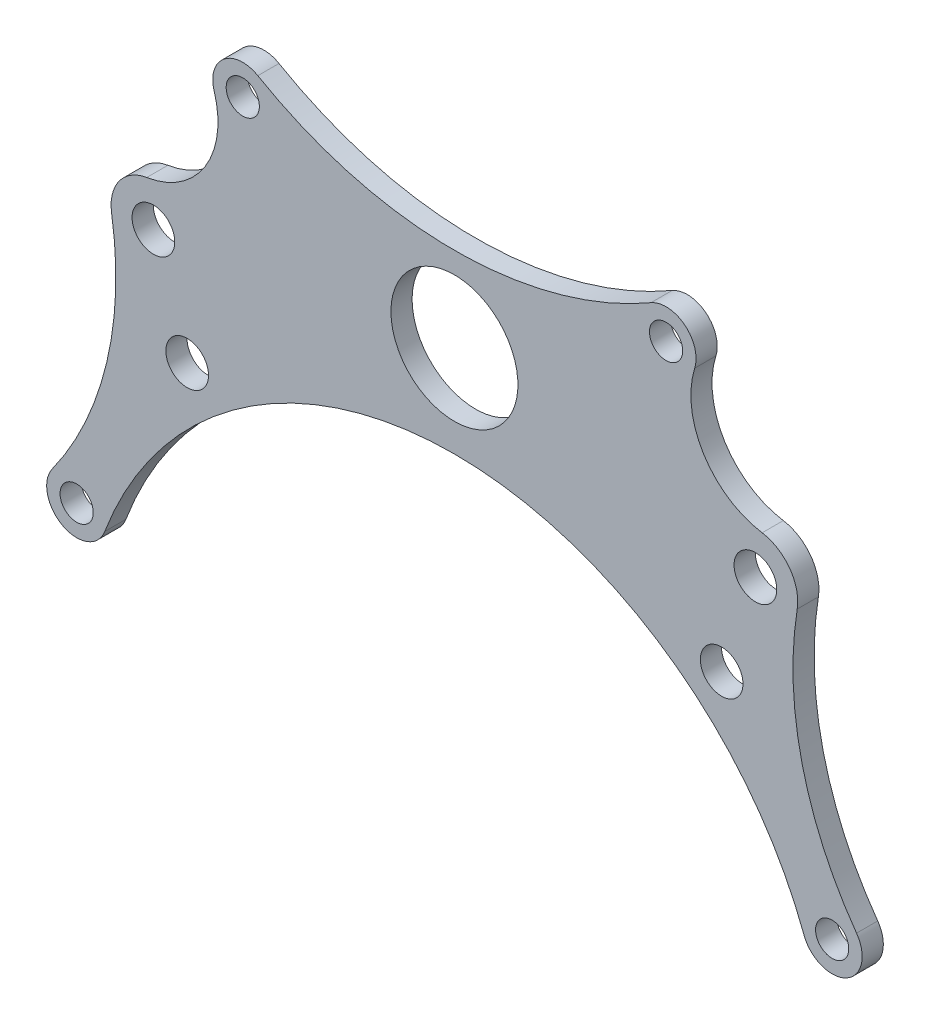
ISO-10303-21;
HEADER;
FILE_DESCRIPTION(('STEP AP214'),'2;1');
FILE_NAME('part.step','',(''),(''),'','','');
FILE_SCHEMA(('AUTOMOTIVE_DESIGN { 1 0 10303 214 1 1 1 1 }'));
ENDSEC;
DATA;
#1=APPLICATION_CONTEXT('core data for automotive mechanical design processes');
#2=APPLICATION_PROTOCOL_DEFINITION('international standard','automotive_design',2000,#1);
#3=PRODUCT_CONTEXT('',#1,'mechanical');
#4=PRODUCT('Part','Part','',(#3));
#5=PRODUCT_RELATED_PRODUCT_CATEGORY('part','',(#4));
#6=PRODUCT_DEFINITION_FORMATION('','',#4);
#7=PRODUCT_DEFINITION_CONTEXT('part definition',#1,'design');
#8=PRODUCT_DEFINITION('design','',#6,#7);
#9=PRODUCT_DEFINITION_SHAPE('','',#8);
#10=(LENGTH_UNIT() NAMED_UNIT(*) SI_UNIT(.MILLI.,.METRE.));
#11=(NAMED_UNIT(*) PLANE_ANGLE_UNIT() SI_UNIT($,.RADIAN.));
#12=(NAMED_UNIT(*) SI_UNIT($,.STERADIAN.) SOLID_ANGLE_UNIT());
#13=UNCERTAINTY_MEASURE_WITH_UNIT(LENGTH_MEASURE(1.E-05),#10,'distance_accuracy_value','');
#14=(GEOMETRIC_REPRESENTATION_CONTEXT(3) GLOBAL_UNCERTAINTY_ASSIGNED_CONTEXT((#13)) GLOBAL_UNIT_ASSIGNED_CONTEXT((#10,
#11,#12)) REPRESENTATION_CONTEXT('',''));
#15=CARTESIAN_POINT('',(0.,0.,0.));
#16=DIRECTION('',(0.,0.,1.));
#17=DIRECTION('',(1.,0.,0.));
#18=AXIS2_PLACEMENT_3D('',#15,#16,#17);
#19=CARTESIAN_POINT('',(0.,0.,-1.5875));
#20=DIRECTION('',(0.,0.,1.));
#21=DIRECTION('',(1.,0.,0.));
#22=AXIS2_PLACEMENT_3D('',#19,#20,#21);
#23=PLANE('',#22);
#24=CARTESIAN_POINT('',(56.664818962211,-48.4680925679622,-1.5875));
#25=DIRECTION('',(0.,0.,-1.));
#26=DIRECTION('',(-1.,0.,0.));
#27=AXIS2_PLACEMENT_3D('',#24,#25,#26);
#28=CIRCLE('',#27,2.48920000000113);
#29=CARTESIAN_POINT('',(54.1756189622098,-48.4680925679622,-1.5875));
#30=VERTEX_POINT('',#29);
#31=EDGE_CURVE('E206',#30,#30,#28,.F.);
#32=ORIENTED_EDGE('',*,*,#31,.T.);
#33=EDGE_LOOP('',(#32));
#34=FACE_BOUND('',#33,.T.);
#35=CARTESIAN_POINT('',(45.1516819359939,-7.18637727584978,-1.5875));
#36=DIRECTION('',(0.,0.,-1.));
#37=DIRECTION('',(-1.,0.,0.));
#38=AXIS2_PLACEMENT_3D('',#35,#36,#37);
#39=CIRCLE('',#38,3.2004);
#40=CARTESIAN_POINT('',(41.9512819359939,-7.18637727584978,-1.5875));
#41=VERTEX_POINT('',#40);
#42=EDGE_CURVE('E209',#41,#41,#39,.F.);
#43=ORIENTED_EDGE('',*,*,#42,.T.);
#44=EDGE_LOOP('',(#43));
#45=FACE_BOUND('',#44,.T.);
#46=CARTESIAN_POINT('',(31.7499999999987,16.7527845666329,-1.5875));
#47=DIRECTION('',(0.,0.,-1.));
#48=DIRECTION('',(-1.,0.,0.));
#49=AXIS2_PLACEMENT_3D('',#46,#47,#48);
#50=CIRCLE('',#49,2.48920000000112);
#51=CARTESIAN_POINT('',(29.2607999999976,16.7527845666329,-1.5875));
#52=VERTEX_POINT('',#51);
#53=EDGE_CURVE('E212',#52,#52,#50,.F.);
#54=ORIENTED_EDGE('',*,*,#53,.T.);
#55=EDGE_LOOP('',(#54));
#56=FACE_BOUND('',#55,.T.);
#57=CARTESIAN_POINT('',(-31.7499999999987,16.7527845666329,-1.5875));
#58=DIRECTION('',(0.,0.,-1.));
#59=DIRECTION('',(-1.,0.,0.));
#60=AXIS2_PLACEMENT_3D('',#57,#58,#59);
#61=CIRCLE('',#60,2.48919999999887);
#62=CARTESIAN_POINT('',(-34.2391999999976,16.7527845666329,-1.5875));
#63=VERTEX_POINT('',#62);
#64=EDGE_CURVE('E215',#63,#63,#61,.F.);
#65=ORIENTED_EDGE('',*,*,#64,.T.);
#66=EDGE_LOOP('',(#65));
#67=FACE_BOUND('',#66,.T.);
#68=CARTESIAN_POINT('',(-45.1516819359939,-7.18637727584978,-1.5875));
#69=DIRECTION('',(0.,0.,-1.));
#70=DIRECTION('',(-1.,0.,0.));
#71=AXIS2_PLACEMENT_3D('',#68,#69,#70);
#72=CIRCLE('',#71,3.2004);
#73=CARTESIAN_POINT('',(-48.3520819359939,-7.18637727584978,-1.5875));
#74=VERTEX_POINT('',#73);
#75=EDGE_CURVE('E218',#74,#74,#72,.F.);
#76=ORIENTED_EDGE('',*,*,#75,.T.);
#77=EDGE_LOOP('',(#76));
#78=FACE_BOUND('',#77,.T.);
#79=CARTESIAN_POINT('',(-56.664818962211,-48.4680925679622,-1.5875));
#80=DIRECTION('',(0.,0.,-1.));
#81=DIRECTION('',(-1.,0.,0.));
#82=AXIS2_PLACEMENT_3D('',#79,#80,#81);
#83=CIRCLE('',#82,2.48920000000113);
#84=CARTESIAN_POINT('',(-59.1540189622121,-48.4680925679622,-1.5875));
#85=VERTEX_POINT('',#84);
#86=EDGE_CURVE('E221',#85,#85,#83,.F.);
#87=ORIENTED_EDGE('',*,*,#86,.T.);
#88=EDGE_LOOP('',(#87));
#89=FACE_BOUND('',#88,.T.);
#90=CARTESIAN_POINT('',(-40.0870796431292,-21.9850959899069,-1.5875));
#91=DIRECTION('',(0.,0.,-1.));
#92=DIRECTION('',(-1.,0.,0.));
#93=AXIS2_PLACEMENT_3D('',#90,#91,#92);
#94=CIRCLE('',#93,3.2004);
#95=CARTESIAN_POINT('',(-43.2874796431292,-21.9850959899069,-1.5875));
#96=VERTEX_POINT('',#95);
#97=EDGE_CURVE('E224',#96,#96,#94,.F.);
#98=ORIENTED_EDGE('',*,*,#97,.T.);
#99=EDGE_LOOP('',(#98));
#100=FACE_BOUND('',#99,.T.);
#101=CARTESIAN_POINT('',(40.0870796431292,-21.9850959899069,-1.5875));
#102=DIRECTION('',(0.,0.,-1.));
#103=DIRECTION('',(-1.,0.,0.));
#104=AXIS2_PLACEMENT_3D('',#101,#102,#103);
#105=CIRCLE('',#104,3.2004);
#106=CARTESIAN_POINT('',(36.8866796431292,-21.9850959899069,-1.5875));
#107=VERTEX_POINT('',#106);
#108=EDGE_CURVE('E227',#107,#107,#105,.F.);
#109=ORIENTED_EDGE('',*,*,#108,.T.);
#110=EDGE_LOOP('',(#109));
#111=FACE_BOUND('',#110,.T.);
#112=CARTESIAN_POINT('',(0.,0.,-1.5875));
#113=DIRECTION('',(0.,0.,-1.));
#114=DIRECTION('',(-1.,0.,0.));
#115=AXIS2_PLACEMENT_3D('',#112,#113,#114);
#116=CIRCLE('',#115,9.525);
#117=CARTESIAN_POINT('',(-9.525,0.,-1.5875));
#118=VERTEX_POINT('',#117);
#119=EDGE_CURVE('E230',#118,#118,#116,.F.);
#120=ORIENTED_EDGE('',*,*,#119,.T.);
#121=EDGE_LOOP('',(#120));
#122=FACE_BOUND('',#121,.T.);
#123=CARTESIAN_POINT('',(-56.664818962211,-48.4680925679622,-1.5875));
#124=DIRECTION('',(0.,0.,-1.));
#125=DIRECTION('',(-1.,0.,0.));
#126=AXIS2_PLACEMENT_3D('',#123,#124,#125);
#127=CIRCLE('',#126,4.50000000000113);
#128=CARTESIAN_POINT('',(-60.3201025397103,-45.8434207850389,-1.5875));
#129=VERTEX_POINT('',#128);
#130=CARTESIAN_POINT('',(-52.4534352093794,-50.0537302587343,-1.5875));
#131=VERTEX_POINT('',#130);
#132=EDGE_CURVE('E234',#129,#131,#127,.F.);
#133=ORIENTED_EDGE('',*,*,#132,.F.);
#134=CARTESIAN_POINT('',(-101.58419270347,-16.213792657823,-1.5875));
#135=DIRECTION('',(0.,0.,-1.));
#136=DIRECTION('',(-1.,0.,0.));
#137=AXIS2_PLACEMENT_3D('',#134,#135,#136);
#138=CIRCLE('',#137,50.8);
#139=CARTESIAN_POINT('',(-51.4219609101579,-8.18942342940237,-1.5875));
#140=VERTEX_POINT('',#139);
#141=EDGE_CURVE('E237',#129,#140,#138,.F.);
#142=ORIENTED_EDGE('',*,*,#141,.T.);
#143=CARTESIAN_POINT('',(-45.1516819359939,-7.18637727584978,-1.5875));
#144=DIRECTION('',(0.,0.,-1.));
#145=DIRECTION('',(-1.,0.,0.));
#146=AXIS2_PLACEMENT_3D('',#143,#144,#145);
#147=CIRCLE('',#146,6.35);
#148=CARTESIAN_POINT('',(-46.156906326464,-0.916447138694824,-1.5875));
#149=VERTEX_POINT('',#148);
#150=EDGE_CURVE('E119',#149,#140,#147,.F.);
#151=ORIENTED_EDGE('',*,*,#150,.F.);
#152=CARTESIAN_POINT('',(-48.1673551074044,11.6234131356151,-1.5875));
#153=DIRECTION('',(0.,0.,-1.));
#154=DIRECTION('',(-1.,0.,0.));
#155=AXIS2_PLACEMENT_3D('',#152,#153,#154);
#156=CIRCLE('',#155,12.7);
#157=CARTESIAN_POINT('',(-36.0452382548427,15.4107978550296,-1.5875));
#158=VERTEX_POINT('',#157);
#159=EDGE_CURVE('E117',#149,#158,#156,.F.);
#160=ORIENTED_EDGE('',*,*,#159,.T.);
#161=CARTESIAN_POINT('',(-31.7499999999987,16.7527845666329,-1.5875));
#162=DIRECTION('',(0.,0.,-1.));
#163=DIRECTION('',(-1.,0.,0.));
#164=AXIS2_PLACEMENT_3D('',#161,#162,#163);
#165=CIRCLE('',#164,4.49999999999887);
#166=CARTESIAN_POINT('',(-29.4896137114734,20.6438838748807,-1.5875));
#167=VERTEX_POINT('',#166);
#168=EDGE_CURVE('E105',#167,#158,#165,.F.);
#169=ORIENTED_EDGE('',*,*,#168,.F.);
#170=CARTESIAN_POINT('',(0.,71.4082227384261,-1.5875));
#171=DIRECTION('',(0.,0.,-1.));
#172=DIRECTION('',(-1.,0.,0.));
#173=AXIS2_PLACEMENT_3D('',#170,#171,#172);
#174=CIRCLE('',#173,58.708222738426);
#175=CARTESIAN_POINT('',(29.4896137114729,20.6438838748817,-1.5875));
#176=VERTEX_POINT('',#175);
#177=EDGE_CURVE('E132',#167,#176,#174,.F.);
#178=ORIENTED_EDGE('',*,*,#177,.T.);
#179=CARTESIAN_POINT('',(31.7499999999987,16.7527845666329,-1.5875));
#180=DIRECTION('',(0.,0.,-1.));
#181=DIRECTION('',(-1.,0.,0.));
#182=AXIS2_PLACEMENT_3D('',#179,#180,#181);
#183=CIRCLE('',#182,4.50000000000113);
#184=CARTESIAN_POINT('',(36.0452382548443,15.4107978550291,-1.5875));
#185=VERTEX_POINT('',#184);
#186=EDGE_CURVE('E138',#185,#176,#183,.F.);
#187=ORIENTED_EDGE('',*,*,#186,.F.);
#188=CARTESIAN_POINT('',(48.1673551074044,11.6234131356151,-1.5875));
#189=DIRECTION('',(0.,0.,-1.));
#190=DIRECTION('',(-1.,0.,0.));
#191=AXIS2_PLACEMENT_3D('',#188,#189,#190);
#192=CIRCLE('',#191,12.7);
#193=CARTESIAN_POINT('',(46.156906326464,-0.916447138694806,-1.5875));
#194=VERTEX_POINT('',#193);
#195=EDGE_CURVE('E141',#185,#194,#192,.F.);
#196=ORIENTED_EDGE('',*,*,#195,.T.);
#197=CARTESIAN_POINT('',(45.1516819359939,-7.18637727584978,-1.5875));
#198=DIRECTION('',(0.,0.,-1.));
#199=DIRECTION('',(-1.,0.,0.));
#200=AXIS2_PLACEMENT_3D('',#197,#198,#199);
#201=CIRCLE('',#200,6.35);
#202=CARTESIAN_POINT('',(51.4219609101579,-8.18942342940236,-1.5875));
#203=VERTEX_POINT('',#202);
#204=EDGE_CURVE('E145',#203,#194,#201,.F.);
#205=ORIENTED_EDGE('',*,*,#204,.F.);
#206=CARTESIAN_POINT('',(101.58419270347,-16.213792657823,-1.5875));
#207=DIRECTION('',(0.,0.,-1.));
#208=DIRECTION('',(-1.,0.,0.));
#209=AXIS2_PLACEMENT_3D('',#206,#207,#208);
#210=CIRCLE('',#209,50.8);
#211=CARTESIAN_POINT('',(60.3201025397103,-45.8434207850389,-1.5875));
#212=VERTEX_POINT('',#211);
#213=EDGE_CURVE('E148',#203,#212,#210,.F.);
#214=ORIENTED_EDGE('',*,*,#213,.T.);
#215=CARTESIAN_POINT('',(56.664818962211,-48.4680925679622,-1.5875));
#216=DIRECTION('',(0.,0.,-1.));
#217=DIRECTION('',(-1.,0.,0.));
#218=AXIS2_PLACEMENT_3D('',#215,#216,#217);
#219=CIRCLE('',#218,4.50000000000113);
#220=CARTESIAN_POINT('',(52.4534352093794,-50.0537302587343,-1.5875));
#221=VERTEX_POINT('',#220);
#222=EDGE_CURVE('E151',#221,#212,#219,.F.);
#223=ORIENTED_EDGE('',*,*,#222,.F.);
#224=CARTESIAN_POINT('',(0.,-69.8030926440881,-1.5875));
#225=DIRECTION('',(0.,0.,-1.));
#226=DIRECTION('',(-1.,0.,0.));
#227=AXIS2_PLACEMENT_3D('',#224,#225,#226);
#228=CIRCLE('',#227,56.0481951528557);
#229=EDGE_CURVE('E20',#221,#131,#228,.F.);
#230=ORIENTED_EDGE('',*,*,#229,.T.);
#231=EDGE_LOOP('',(#133,#142,#151,#160,#169,#178,#187,#196,#205,#214,#223,#230));
#232=FACE_BOUND('',#231,.T.);
#233=ADVANCED_FACE('F17',(#34,#45,#56,#67,#78,#89,#100,#111,#122,#232),#23,.F.);
#234=CARTESIAN_POINT('',(0.,-69.8030926440881,1.5875));
#235=DIRECTION('',(0.,0.,-1.));
#236=DIRECTION('',(-1.,0.,0.));
#237=AXIS2_PLACEMENT_3D('',#234,#235,#236);
#238=CYLINDRICAL_SURFACE('',#237,56.0481951528557);
#239=DIRECTION('',(0.,0.,-1.));
#240=VECTOR('',#239,1.);
#241=CARTESIAN_POINT('',(52.4534352093794,-50.0537302587343,1.5875));
#242=LINE('',#241,#240);
#243=CARTESIAN_POINT('',(52.4534352093794,-50.0537302587343,1.5875));
#244=VERTEX_POINT('',#243);
#245=EDGE_CURVE('E149',#244,#221,#242,.T.);
#246=ORIENTED_EDGE('',*,*,#245,.F.);
#247=CARTESIAN_POINT('',(0.,-69.8030926440881,1.5875));
#248=DIRECTION('',(0.,0.,-1.));
#249=DIRECTION('',(-1.,0.,0.));
#250=AXIS2_PLACEMENT_3D('',#247,#248,#249);
#251=CIRCLE('',#250,56.0481951528557);
#252=CARTESIAN_POINT('',(-52.4534352093794,-50.0537302587343,1.5875));
#253=VERTEX_POINT('',#252);
#254=EDGE_CURVE('E203',#253,#244,#251,.T.);
#255=ORIENTED_EDGE('',*,*,#254,.F.);
#256=DIRECTION('',(0.,0.,-1.));
#257=VECTOR('',#256,1.);
#258=CARTESIAN_POINT('',(-52.4534352093794,-50.0537302587343,1.5875));
#259=LINE('',#258,#257);
#260=EDGE_CURVE('E233',#131,#253,#259,.F.);
#261=ORIENTED_EDGE('',*,*,#260,.F.);
#262=ORIENTED_EDGE('',*,*,#229,.F.);
#263=EDGE_LOOP('',(#246,#255,#261,#262));
#264=FACE_BOUND('',#263,.T.);
#265=ADVANCED_FACE('F254',(#264),#238,.F.);
#266=CARTESIAN_POINT('',(56.664818962211,-48.4680925679622,1.5875));
#267=DIRECTION('',(0.,0.,-1.));
#268=DIRECTION('',(-1.,0.,0.));
#269=AXIS2_PLACEMENT_3D('',#266,#267,#268);
#270=CYLINDRICAL_SURFACE('',#269,4.50000000000113);
#271=CARTESIAN_POINT('',(56.664818962211,-48.4680925679622,1.5875));
#272=DIRECTION('',(0.,0.,-1.));
#273=DIRECTION('',(-1.,0.,0.));
#274=AXIS2_PLACEMENT_3D('',#271,#272,#273);
#275=CIRCLE('',#274,4.50000000000113);
#276=CARTESIAN_POINT('',(60.3201025397103,-45.8434207850389,1.5875));
#277=VERTEX_POINT('',#276);
#278=EDGE_CURVE('E200',#244,#277,#275,.F.);
#279=ORIENTED_EDGE('',*,*,#278,.F.);
#280=ORIENTED_EDGE('',*,*,#245,.T.);
#281=ORIENTED_EDGE('',*,*,#222,.T.);
#282=DIRECTION('',(0.,0.,-1.));
#283=VECTOR('',#282,1.);
#284=CARTESIAN_POINT('',(60.3201025397103,-45.8434207850389,1.5875));
#285=LINE('',#284,#283);
#286=EDGE_CURVE('E146',#212,#277,#285,.F.);
#287=ORIENTED_EDGE('',*,*,#286,.T.);
#288=EDGE_LOOP('',(#279,#280,#281,#287));
#289=FACE_BOUND('',#288,.T.);
#290=ADVANCED_FACE('F467',(#289),#270,.T.);
#291=CARTESIAN_POINT('',(101.58419270347,-16.213792657823,1.5875));
#292=DIRECTION('',(0.,0.,-1.));
#293=DIRECTION('',(-1.,0.,0.));
#294=AXIS2_PLACEMENT_3D('',#291,#292,#293);
#295=CYLINDRICAL_SURFACE('',#294,50.8);
#296=DIRECTION('',(0.,0.,-1.));
#297=VECTOR('',#296,1.);
#298=CARTESIAN_POINT('',(51.4219609101579,-8.18942342940236,1.5875));
#299=LINE('',#298,#297);
#300=CARTESIAN_POINT('',(51.4219609101579,-8.18942342940236,1.5875));
#301=VERTEX_POINT('',#300);
#302=EDGE_CURVE('E142',#301,#203,#299,.T.);
#303=ORIENTED_EDGE('',*,*,#302,.F.);
#304=CARTESIAN_POINT('',(101.58419270347,-16.213792657823,1.5875));
#305=DIRECTION('',(0.,0.,-1.));
#306=DIRECTION('',(-1.,0.,0.));
#307=AXIS2_PLACEMENT_3D('',#304,#305,#306);
#308=CIRCLE('',#307,50.8);
#309=EDGE_CURVE('E198',#277,#301,#308,.T.);
#310=ORIENTED_EDGE('',*,*,#309,.F.);
#311=ORIENTED_EDGE('',*,*,#286,.F.);
#312=ORIENTED_EDGE('',*,*,#213,.F.);
#313=EDGE_LOOP('',(#303,#310,#311,#312));
#314=FACE_BOUND('',#313,.T.);
#315=ADVANCED_FACE('F458',(#314),#295,.F.);
#316=CARTESIAN_POINT('',(45.1516819359939,-7.18637727584978,1.5875));
#317=DIRECTION('',(0.,0.,-1.));
#318=DIRECTION('',(-1.,0.,0.));
#319=AXIS2_PLACEMENT_3D('',#316,#317,#318);
#320=CYLINDRICAL_SURFACE('',#319,6.35);
#321=CARTESIAN_POINT('',(45.1516819359939,-7.18637727584978,1.5875));
#322=DIRECTION('',(0.,0.,-1.));
#323=DIRECTION('',(-1.,0.,0.));
#324=AXIS2_PLACEMENT_3D('',#321,#322,#323);
#325=CIRCLE('',#324,6.35);
#326=CARTESIAN_POINT('',(46.156906326464,-0.916447138694806,1.5875));
#327=VERTEX_POINT('',#326);
#328=EDGE_CURVE('E195',#301,#327,#325,.F.);
#329=ORIENTED_EDGE('',*,*,#328,.F.);
#330=ORIENTED_EDGE('',*,*,#302,.T.);
#331=ORIENTED_EDGE('',*,*,#204,.T.);
#332=DIRECTION('',(0.,0.,-1.));
#333=VECTOR('',#332,1.);
#334=CARTESIAN_POINT('',(46.156906326464,-0.916447138694806,1.5875));
#335=LINE('',#334,#333);
#336=EDGE_CURVE('E139',#194,#327,#335,.F.);
#337=ORIENTED_EDGE('',*,*,#336,.T.);
#338=EDGE_LOOP('',(#329,#330,#331,#337));
#339=FACE_BOUND('',#338,.T.);
#340=ADVANCED_FACE('F288',(#339),#320,.T.);
#341=CARTESIAN_POINT('',(48.1673551074044,11.6234131356151,1.5875));
#342=DIRECTION('',(0.,0.,-1.));
#343=DIRECTION('',(-1.,0.,0.));
#344=AXIS2_PLACEMENT_3D('',#341,#342,#343);
#345=CYLINDRICAL_SURFACE('',#344,12.7);
#346=DIRECTION('',(0.,0.,-1.));
#347=VECTOR('',#346,1.);
#348=CARTESIAN_POINT('',(36.0452382548443,15.4107978550291,1.5875));
#349=LINE('',#348,#347);
#350=CARTESIAN_POINT('',(36.0452382548443,15.4107978550291,1.5875));
#351=VERTEX_POINT('',#350);
#352=EDGE_CURVE('E135',#351,#185,#349,.T.);
#353=ORIENTED_EDGE('',*,*,#352,.F.);
#354=CARTESIAN_POINT('',(48.1673551074044,11.6234131356151,1.5875));
#355=DIRECTION('',(0.,0.,-1.));
#356=DIRECTION('',(-1.,0.,0.));
#357=AXIS2_PLACEMENT_3D('',#354,#355,#356);
#358=CIRCLE('',#357,12.7);
#359=EDGE_CURVE('E193',#327,#351,#358,.T.);
#360=ORIENTED_EDGE('',*,*,#359,.F.);
#361=ORIENTED_EDGE('',*,*,#336,.F.);
#362=ORIENTED_EDGE('',*,*,#195,.F.);
#363=EDGE_LOOP('',(#353,#360,#361,#362));
#364=FACE_BOUND('',#363,.T.);
#365=ADVANCED_FACE('F277',(#364),#345,.F.);
#366=CARTESIAN_POINT('',(31.7499999999987,16.7527845666329,1.5875));
#367=DIRECTION('',(0.,0.,-1.));
#368=DIRECTION('',(-1.,0.,0.));
#369=AXIS2_PLACEMENT_3D('',#366,#367,#368);
#370=CYLINDRICAL_SURFACE('',#369,4.50000000000113);
#371=CARTESIAN_POINT('',(31.7499999999987,16.7527845666329,1.5875));
#372=DIRECTION('',(0.,0.,-1.));
#373=DIRECTION('',(-1.,0.,0.));
#374=AXIS2_PLACEMENT_3D('',#371,#372,#373);
#375=CIRCLE('',#374,4.50000000000113);
#376=CARTESIAN_POINT('',(29.4896137114729,20.6438838748817,1.5875));
#377=VERTEX_POINT('',#376);
#378=EDGE_CURVE('E190',#351,#377,#375,.F.);
#379=ORIENTED_EDGE('',*,*,#378,.F.);
#380=ORIENTED_EDGE('',*,*,#352,.T.);
#381=ORIENTED_EDGE('',*,*,#186,.T.);
#382=DIRECTION('',(0.,0.,-1.));
#383=VECTOR('',#382,1.);
#384=CARTESIAN_POINT('',(29.4896137114729,20.6438838748817,1.5875));
#385=LINE('',#384,#383);
#386=EDGE_CURVE('E133',#176,#377,#385,.F.);
#387=ORIENTED_EDGE('',*,*,#386,.T.);
#388=EDGE_LOOP('',(#379,#380,#381,#387));
#389=FACE_BOUND('',#388,.T.);
#390=ADVANCED_FACE('F279',(#389),#370,.T.);
#391=CARTESIAN_POINT('',(0.,71.4082227384261,1.5875));
#392=DIRECTION('',(0.,0.,-1.));
#393=DIRECTION('',(-1.,0.,0.));
#394=AXIS2_PLACEMENT_3D('',#391,#392,#393);
#395=CYLINDRICAL_SURFACE('',#394,58.708222738426);
#396=DIRECTION('',(0.,0.,-1.));
#397=VECTOR('',#396,1.);
#398=CARTESIAN_POINT('',(-29.489613711474,20.6438838748798,1.5875));
#399=LINE('',#398,#397);
#400=CARTESIAN_POINT('',(-29.489613711474,20.6438838748798,1.5875));
#401=VERTEX_POINT('',#400);
#402=EDGE_CURVE('E112',#401,#167,#399,.T.);
#403=ORIENTED_EDGE('',*,*,#402,.F.);
#404=CARTESIAN_POINT('',(0.,71.4082227384261,1.5875));
#405=DIRECTION('',(0.,0.,-1.));
#406=DIRECTION('',(-1.,0.,0.));
#407=AXIS2_PLACEMENT_3D('',#404,#405,#406);
#408=CIRCLE('',#407,58.708222738426);
#409=EDGE_CURVE('E187',#377,#401,#408,.T.);
#410=ORIENTED_EDGE('',*,*,#409,.F.);
#411=ORIENTED_EDGE('',*,*,#386,.F.);
#412=ORIENTED_EDGE('',*,*,#177,.F.);
#413=EDGE_LOOP('',(#403,#410,#411,#412));
#414=FACE_BOUND('',#413,.T.);
#415=ADVANCED_FACE('F271',(#414),#395,.F.);
#416=CARTESIAN_POINT('',(-31.7499999999987,16.7527845666329,1.5875));
#417=DIRECTION('',(0.,0.,-1.));
#418=DIRECTION('',(-1.,0.,0.));
#419=AXIS2_PLACEMENT_3D('',#416,#417,#418);
#420=CYLINDRICAL_SURFACE('',#419,4.49999999999887);
#421=ORIENTED_EDGE('',*,*,#402,.T.);
#422=ORIENTED_EDGE('',*,*,#168,.T.);
#423=DIRECTION('',(0.,0.,-1.));
#424=VECTOR('',#423,1.);
#425=CARTESIAN_POINT('',(-36.0452382548432,15.4107978550294,1.5875));
#426=LINE('',#425,#424);
#427=CARTESIAN_POINT('',(-36.0452382548427,15.4107978550296,1.5875));
#428=VERTEX_POINT('',#427);
#429=EDGE_CURVE('E110',#158,#428,#426,.F.);
#430=ORIENTED_EDGE('',*,*,#429,.T.);
#431=CARTESIAN_POINT('',(-31.7499999999987,16.7527845666329,1.5875));
#432=DIRECTION('',(0.,0.,-1.));
#433=DIRECTION('',(-1.,0.,0.));
#434=AXIS2_PLACEMENT_3D('',#431,#432,#433);
#435=CIRCLE('',#434,4.49999999999887);
#436=EDGE_CURVE('E184',#401,#428,#435,.F.);
#437=ORIENTED_EDGE('',*,*,#436,.F.);
#438=EDGE_LOOP('',(#421,#422,#430,#437));
#439=FACE_BOUND('',#438,.T.);
#440=ADVANCED_FACE('F107',(#439),#420,.T.);
#441=CARTESIAN_POINT('',(-48.1673551074044,11.6234131356151,1.5875));
#442=DIRECTION('',(0.,0.,-1.));
#443=DIRECTION('',(-1.,0.,0.));
#444=AXIS2_PLACEMENT_3D('',#441,#442,#443);
#445=CYLINDRICAL_SURFACE('',#444,12.7);
#446=DIRECTION('',(0.,0.,-1.));
#447=VECTOR('',#446,1.);
#448=CARTESIAN_POINT('',(-46.156906326464,-0.916447138694831,1.5875));
#449=LINE('',#448,#447);
#450=CARTESIAN_POINT('',(-46.156906326464,-0.916447138694831,1.5875));
#451=VERTEX_POINT('',#450);
#452=EDGE_CURVE('E122',#451,#149,#449,.T.);
#453=ORIENTED_EDGE('',*,*,#452,.F.);
#454=CARTESIAN_POINT('',(-48.1673551074044,11.6234131356151,1.5875));
#455=DIRECTION('',(0.,0.,-1.));
#456=DIRECTION('',(-1.,0.,0.));
#457=AXIS2_PLACEMENT_3D('',#454,#455,#456);
#458=CIRCLE('',#457,12.7);
#459=EDGE_CURVE('E126',#428,#451,#458,.T.);
#460=ORIENTED_EDGE('',*,*,#459,.F.);
#461=ORIENTED_EDGE('',*,*,#429,.F.);
#462=ORIENTED_EDGE('',*,*,#159,.F.);
#463=EDGE_LOOP('',(#453,#460,#461,#462));
#464=FACE_BOUND('',#463,.T.);
#465=ADVANCED_FACE('F124',(#464),#445,.F.);
#466=CARTESIAN_POINT('',(-45.1516819359939,-7.18637727584978,1.5875));
#467=DIRECTION('',(0.,0.,-1.));
#468=DIRECTION('',(-1.,0.,0.));
#469=AXIS2_PLACEMENT_3D('',#466,#467,#468);
#470=CYLINDRICAL_SURFACE('',#469,6.35);
#471=ORIENTED_EDGE('',*,*,#452,.T.);
#472=ORIENTED_EDGE('',*,*,#150,.T.);
#473=DIRECTION('',(0.,0.,-1.));
#474=VECTOR('',#473,1.);
#475=CARTESIAN_POINT('',(-51.4219609101579,-8.18942342940238,1.5875));
#476=LINE('',#475,#474);
#477=CARTESIAN_POINT('',(-51.4219609101579,-8.18942342940237,1.5875));
#478=VERTEX_POINT('',#477);
#479=EDGE_CURVE('E239',#140,#478,#476,.F.);
#480=ORIENTED_EDGE('',*,*,#479,.T.);
#481=CARTESIAN_POINT('',(-45.1516819359939,-7.18637727584978,1.5875));
#482=DIRECTION('',(0.,0.,-1.));
#483=DIRECTION('',(-1.,0.,0.));
#484=AXIS2_PLACEMENT_3D('',#481,#482,#483);
#485=CIRCLE('',#484,6.35);
#486=EDGE_CURVE('E181',#451,#478,#485,.F.);
#487=ORIENTED_EDGE('',*,*,#486,.F.);
#488=EDGE_LOOP('',(#471,#472,#480,#487));
#489=FACE_BOUND('',#488,.T.);
#490=ADVANCED_FACE('F263',(#489),#470,.T.);
#491=CARTESIAN_POINT('',(-101.58419270347,-16.213792657823,1.5875));
#492=DIRECTION('',(0.,0.,-1.));
#493=DIRECTION('',(-1.,0.,0.));
#494=AXIS2_PLACEMENT_3D('',#491,#492,#493);
#495=CYLINDRICAL_SURFACE('',#494,50.8);
#496=DIRECTION('',(0.,0.,-1.));
#497=VECTOR('',#496,1.);
#498=CARTESIAN_POINT('',(-60.3201025397103,-45.8434207850389,1.5875));
#499=LINE('',#498,#497);
#500=CARTESIAN_POINT('',(-60.3201025397103,-45.8434207850389,1.5875));
#501=VERTEX_POINT('',#500);
#502=EDGE_CURVE('E35',#501,#129,#499,.T.);
#503=ORIENTED_EDGE('',*,*,#502,.F.);
#504=CARTESIAN_POINT('',(-101.58419270347,-16.213792657823,1.5875));
#505=DIRECTION('',(0.,0.,-1.));
#506=DIRECTION('',(-1.,0.,0.));
#507=AXIS2_PLACEMENT_3D('',#504,#505,#506);
#508=CIRCLE('',#507,50.8);
#509=EDGE_CURVE('E178',#478,#501,#508,.T.);
#510=ORIENTED_EDGE('',*,*,#509,.F.);
#511=ORIENTED_EDGE('',*,*,#479,.F.);
#512=ORIENTED_EDGE('',*,*,#141,.F.);
#513=EDGE_LOOP('',(#503,#510,#511,#512));
#514=FACE_BOUND('',#513,.T.);
#515=ADVANCED_FACE('F264',(#514),#495,.F.);
#516=CARTESIAN_POINT('',(-56.664818962211,-48.4680925679622,1.5875));
#517=DIRECTION('',(0.,0.,-1.));
#518=DIRECTION('',(-1.,0.,0.));
#519=AXIS2_PLACEMENT_3D('',#516,#517,#518);
#520=CYLINDRICAL_SURFACE('',#519,4.50000000000113);
#521=ORIENTED_EDGE('',*,*,#132,.T.);
#522=ORIENTED_EDGE('',*,*,#260,.T.);
#523=CARTESIAN_POINT('',(-56.664818962211,-48.4680925679622,1.5875));
#524=DIRECTION('',(0.,0.,-1.));
#525=DIRECTION('',(-1.,0.,0.));
#526=AXIS2_PLACEMENT_3D('',#523,#524,#525);
#527=CIRCLE('',#526,4.50000000000113);
#528=EDGE_CURVE('E176',#501,#253,#527,.F.);
#529=ORIENTED_EDGE('',*,*,#528,.F.);
#530=ORIENTED_EDGE('',*,*,#502,.T.);
#531=EDGE_LOOP('',(#521,#522,#529,#530));
#532=FACE_BOUND('',#531,.T.);
#533=ADVANCED_FACE('F257',(#532),#520,.T.);
#534=CARTESIAN_POINT('',(0.,0.,1.5875));
#535=DIRECTION('',(0.,0.,-1.));
#536=DIRECTION('',(-1.,0.,0.));
#537=AXIS2_PLACEMENT_3D('',#534,#535,#536);
#538=CYLINDRICAL_SURFACE('',#537,9.525);
#539=CARTESIAN_POINT('',(0.,0.,1.5875));
#540=DIRECTION('',(0.,0.,-1.));
#541=DIRECTION('',(-1.,0.,0.));
#542=AXIS2_PLACEMENT_3D('',#539,#540,#541);
#543=CIRCLE('',#542,9.525);
#544=CARTESIAN_POINT('',(-9.525,0.,1.5875));
#545=VERTEX_POINT('',#544);
#546=EDGE_CURVE('E173',#545,#545,#543,.T.);
#547=ORIENTED_EDGE('',*,*,#546,.F.);
#548=EDGE_LOOP('',(#547));
#549=FACE_BOUND('',#548,.T.);
#550=ORIENTED_EDGE('',*,*,#119,.F.);
#551=EDGE_LOOP('',(#550));
#552=FACE_BOUND('',#551,.T.);
#553=ADVANCED_FACE('F328',(#549,#552),#538,.F.);
#554=CARTESIAN_POINT('',(40.0870796431292,-21.9850959899069,1.5875));
#555=DIRECTION('',(0.,0.,-1.));
#556=DIRECTION('',(-1.,0.,0.));
#557=AXIS2_PLACEMENT_3D('',#554,#555,#556);
#558=CYLINDRICAL_SURFACE('',#557,3.2004);
#559=CARTESIAN_POINT('',(40.0870796431292,-21.9850959899069,1.5875));
#560=DIRECTION('',(0.,0.,-1.));
#561=DIRECTION('',(-1.,0.,0.));
#562=AXIS2_PLACEMENT_3D('',#559,#560,#561);
#563=CIRCLE('',#562,3.2004);
#564=CARTESIAN_POINT('',(36.8866796431292,-21.9850959899069,1.5875));
#565=VERTEX_POINT('',#564);
#566=EDGE_CURVE('E170',#565,#565,#563,.T.);
#567=ORIENTED_EDGE('',*,*,#566,.F.);
#568=EDGE_LOOP('',(#567));
#569=FACE_BOUND('',#568,.T.);
#570=ORIENTED_EDGE('',*,*,#108,.F.);
#571=EDGE_LOOP('',(#570));
#572=FACE_BOUND('',#571,.T.);
#573=ADVANCED_FACE('F324',(#569,#572),#558,.F.);
#574=CARTESIAN_POINT('',(-40.0870796431292,-21.9850959899069,1.5875));
#575=DIRECTION('',(0.,0.,-1.));
#576=DIRECTION('',(-1.,0.,0.));
#577=AXIS2_PLACEMENT_3D('',#574,#575,#576);
#578=CYLINDRICAL_SURFACE('',#577,3.2004);
#579=CARTESIAN_POINT('',(-40.0870796431292,-21.9850959899069,1.5875));
#580=DIRECTION('',(0.,0.,-1.));
#581=DIRECTION('',(-1.,0.,0.));
#582=AXIS2_PLACEMENT_3D('',#579,#580,#581);
#583=CIRCLE('',#582,3.2004);
#584=CARTESIAN_POINT('',(-43.2874796431292,-21.9850959899069,1.5875));
#585=VERTEX_POINT('',#584);
#586=EDGE_CURVE('E167',#585,#585,#583,.T.);
#587=ORIENTED_EDGE('',*,*,#586,.F.);
#588=EDGE_LOOP('',(#587));
#589=FACE_BOUND('',#588,.T.);
#590=ORIENTED_EDGE('',*,*,#97,.F.);
#591=EDGE_LOOP('',(#590));
#592=FACE_BOUND('',#591,.T.);
#593=ADVANCED_FACE('F320',(#589,#592),#578,.F.);
#594=CARTESIAN_POINT('',(-56.664818962211,-48.4680925679622,1.5875));
#595=DIRECTION('',(0.,0.,-1.));
#596=DIRECTION('',(-1.,0.,0.));
#597=AXIS2_PLACEMENT_3D('',#594,#595,#596);
#598=CYLINDRICAL_SURFACE('',#597,2.48920000000113);
#599=CARTESIAN_POINT('',(-56.664818962211,-48.4680925679622,1.5875));
#600=DIRECTION('',(0.,0.,-1.));
#601=DIRECTION('',(-1.,0.,0.));
#602=AXIS2_PLACEMENT_3D('',#599,#600,#601);
#603=CIRCLE('',#602,2.48920000000113);
#604=CARTESIAN_POINT('',(-59.1540189622121,-48.4680925679622,1.5875));
#605=VERTEX_POINT('',#604);
#606=EDGE_CURVE('E164',#605,#605,#603,.T.);
#607=ORIENTED_EDGE('',*,*,#606,.F.);
#608=EDGE_LOOP('',(#607));
#609=FACE_BOUND('',#608,.T.);
#610=ORIENTED_EDGE('',*,*,#86,.F.);
#611=EDGE_LOOP('',(#610));
#612=FACE_BOUND('',#611,.T.);
#613=ADVANCED_FACE('F316',(#609,#612),#598,.F.);
#614=CARTESIAN_POINT('',(-45.1516819359939,-7.18637727584978,1.5875));
#615=DIRECTION('',(0.,0.,-1.));
#616=DIRECTION('',(-1.,0.,0.));
#617=AXIS2_PLACEMENT_3D('',#614,#615,#616);
#618=CYLINDRICAL_SURFACE('',#617,3.2004);
#619=CARTESIAN_POINT('',(-45.1516819359939,-7.18637727584978,1.5875));
#620=DIRECTION('',(0.,0.,-1.));
#621=DIRECTION('',(-1.,0.,0.));
#622=AXIS2_PLACEMENT_3D('',#619,#620,#621);
#623=CIRCLE('',#622,3.2004);
#624=CARTESIAN_POINT('',(-48.3520819359939,-7.18637727584978,1.5875));
#625=VERTEX_POINT('',#624);
#626=EDGE_CURVE('E161',#625,#625,#623,.T.);
#627=ORIENTED_EDGE('',*,*,#626,.F.);
#628=EDGE_LOOP('',(#627));
#629=FACE_BOUND('',#628,.T.);
#630=ORIENTED_EDGE('',*,*,#75,.F.);
#631=EDGE_LOOP('',(#630));
#632=FACE_BOUND('',#631,.T.);
#633=ADVANCED_FACE('F312',(#629,#632),#618,.F.);
#634=CARTESIAN_POINT('',(-31.7499999999987,16.7527845666329,1.5875));
#635=DIRECTION('',(0.,0.,-1.));
#636=DIRECTION('',(-1.,0.,0.));
#637=AXIS2_PLACEMENT_3D('',#634,#635,#636);
#638=CYLINDRICAL_SURFACE('',#637,2.48919999999887);
#639=CARTESIAN_POINT('',(-31.7499999999987,16.7527845666329,1.5875));
#640=DIRECTION('',(0.,0.,-1.));
#641=DIRECTION('',(-1.,0.,0.));
#642=AXIS2_PLACEMENT_3D('',#639,#640,#641);
#643=CIRCLE('',#642,2.48919999999887);
#644=CARTESIAN_POINT('',(-34.2391999999976,16.7527845666329,1.5875));
#645=VERTEX_POINT('',#644);
#646=EDGE_CURVE('E158',#645,#645,#643,.T.);
#647=ORIENTED_EDGE('',*,*,#646,.F.);
#648=EDGE_LOOP('',(#647));
#649=FACE_BOUND('',#648,.T.);
#650=ORIENTED_EDGE('',*,*,#64,.F.);
#651=EDGE_LOOP('',(#650));
#652=FACE_BOUND('',#651,.T.);
#653=ADVANCED_FACE('F308',(#649,#652),#638,.F.);
#654=CARTESIAN_POINT('',(31.7499999999987,16.7527845666329,1.5875));
#655=DIRECTION('',(0.,0.,-1.));
#656=DIRECTION('',(-1.,0.,0.));
#657=AXIS2_PLACEMENT_3D('',#654,#655,#656);
#658=CYLINDRICAL_SURFACE('',#657,2.48920000000112);
#659=CARTESIAN_POINT('',(31.7499999999987,16.7527845666329,1.5875));
#660=DIRECTION('',(0.,0.,-1.));
#661=DIRECTION('',(-1.,0.,0.));
#662=AXIS2_PLACEMENT_3D('',#659,#660,#661);
#663=CIRCLE('',#662,2.48920000000112);
#664=CARTESIAN_POINT('',(29.2607999999976,16.7527845666329,1.5875));
#665=VERTEX_POINT('',#664);
#666=EDGE_CURVE('E155',#665,#665,#663,.T.);
#667=ORIENTED_EDGE('',*,*,#666,.F.);
#668=EDGE_LOOP('',(#667));
#669=FACE_BOUND('',#668,.T.);
#670=ORIENTED_EDGE('',*,*,#53,.F.);
#671=EDGE_LOOP('',(#670));
#672=FACE_BOUND('',#671,.T.);
#673=ADVANCED_FACE('F304',(#669,#672),#658,.F.);
#674=CARTESIAN_POINT('',(45.1516819359939,-7.18637727584978,1.5875));
#675=DIRECTION('',(0.,0.,-1.));
#676=DIRECTION('',(-1.,0.,0.));
#677=AXIS2_PLACEMENT_3D('',#674,#675,#676);
#678=CYLINDRICAL_SURFACE('',#677,3.2004);
#679=CARTESIAN_POINT('',(45.1516819359939,-7.18637727584978,1.5875));
#680=DIRECTION('',(0.,0.,-1.));
#681=DIRECTION('',(-1.,0.,0.));
#682=AXIS2_PLACEMENT_3D('',#679,#680,#681);
#683=CIRCLE('',#682,3.2004);
#684=CARTESIAN_POINT('',(41.9512819359939,-7.18637727584978,1.5875));
#685=VERTEX_POINT('',#684);
#686=EDGE_CURVE('E26',#685,#685,#683,.T.);
#687=ORIENTED_EDGE('',*,*,#686,.F.);
#688=EDGE_LOOP('',(#687));
#689=FACE_BOUND('',#688,.T.);
#690=ORIENTED_EDGE('',*,*,#42,.F.);
#691=EDGE_LOOP('',(#690));
#692=FACE_BOUND('',#691,.T.);
#693=ADVANCED_FACE('F297',(#689,#692),#678,.F.);
#694=CARTESIAN_POINT('',(56.664818962211,-48.4680925679622,1.5875));
#695=DIRECTION('',(0.,0.,-1.));
#696=DIRECTION('',(-1.,0.,0.));
#697=AXIS2_PLACEMENT_3D('',#694,#695,#696);
#698=CYLINDRICAL_SURFACE('',#697,2.48920000000113);
#699=CARTESIAN_POINT('',(56.664818962211,-48.4680925679622,1.5875));
#700=DIRECTION('',(0.,0.,-1.));
#701=DIRECTION('',(-1.,0.,0.));
#702=AXIS2_PLACEMENT_3D('',#699,#700,#701);
#703=CIRCLE('',#702,2.48920000000113);
#704=CARTESIAN_POINT('',(54.1756189622098,-48.4680925679622,1.5875));
#705=VERTEX_POINT('',#704);
#706=EDGE_CURVE('E11',#705,#705,#703,.T.);
#707=ORIENTED_EDGE('',*,*,#706,.F.);
#708=EDGE_LOOP('',(#707));
#709=FACE_BOUND('',#708,.T.);
#710=ORIENTED_EDGE('',*,*,#31,.F.);
#711=EDGE_LOOP('',(#710));
#712=FACE_BOUND('',#711,.T.);
#713=ADVANCED_FACE('F291',(#709,#712),#698,.F.);
#714=CARTESIAN_POINT('',(0.,0.,1.5875));
#715=DIRECTION('',(0.,0.,1.));
#716=DIRECTION('',(1.,0.,0.));
#717=AXIS2_PLACEMENT_3D('',#714,#715,#716);
#718=PLANE('',#717);
#719=ORIENTED_EDGE('',*,*,#706,.T.);
#720=EDGE_LOOP('',(#719));
#721=FACE_BOUND('',#720,.T.);
#722=ORIENTED_EDGE('',*,*,#686,.T.);
#723=EDGE_LOOP('',(#722));
#724=FACE_BOUND('',#723,.T.);
#725=ORIENTED_EDGE('',*,*,#666,.T.);
#726=EDGE_LOOP('',(#725));
#727=FACE_BOUND('',#726,.T.);
#728=ORIENTED_EDGE('',*,*,#646,.T.);
#729=EDGE_LOOP('',(#728));
#730=FACE_BOUND('',#729,.T.);
#731=ORIENTED_EDGE('',*,*,#626,.T.);
#732=EDGE_LOOP('',(#731));
#733=FACE_BOUND('',#732,.T.);
#734=ORIENTED_EDGE('',*,*,#606,.T.);
#735=EDGE_LOOP('',(#734));
#736=FACE_BOUND('',#735,.T.);
#737=ORIENTED_EDGE('',*,*,#586,.T.);
#738=EDGE_LOOP('',(#737));
#739=FACE_BOUND('',#738,.T.);
#740=ORIENTED_EDGE('',*,*,#566,.T.);
#741=EDGE_LOOP('',(#740));
#742=FACE_BOUND('',#741,.T.);
#743=ORIENTED_EDGE('',*,*,#546,.T.);
#744=EDGE_LOOP('',(#743));
#745=FACE_BOUND('',#744,.T.);
#746=ORIENTED_EDGE('',*,*,#528,.T.);
#747=ORIENTED_EDGE('',*,*,#254,.T.);
#748=ORIENTED_EDGE('',*,*,#278,.T.);
#749=ORIENTED_EDGE('',*,*,#309,.T.);
#750=ORIENTED_EDGE('',*,*,#328,.T.);
#751=ORIENTED_EDGE('',*,*,#359,.T.);
#752=ORIENTED_EDGE('',*,*,#378,.T.);
#753=ORIENTED_EDGE('',*,*,#409,.T.);
#754=ORIENTED_EDGE('',*,*,#436,.T.);
#755=ORIENTED_EDGE('',*,*,#459,.T.);
#756=ORIENTED_EDGE('',*,*,#486,.T.);
#757=ORIENTED_EDGE('',*,*,#509,.T.);
#758=EDGE_LOOP('',(#746,#747,#748,#749,#750,#751,#752,#753,#754,#755,#756,#757));
#759=FACE_BOUND('',#758,.T.);
#760=ADVANCED_FACE('F266',(#721,#724,#727,#730,#733,#736,#739,#742,#745,#759),#718,.T.);
#761=CLOSED_SHELL('',(#233,#265,#290,#315,#340,#365,#390,#415,#440,#465,#490,#515,#533,#553,
#573,#593,#613,#633,#653,#673,#693,#713,#760));
#762=MANIFOLD_SOLID_BREP('B1',#761);
#763=ADVANCED_BREP_SHAPE_REPRESENTATION('',(#18,#762),#14);
#764=SHAPE_DEFINITION_REPRESENTATION(#9,#763);
ENDSEC;
END-ISO-10303-21;
